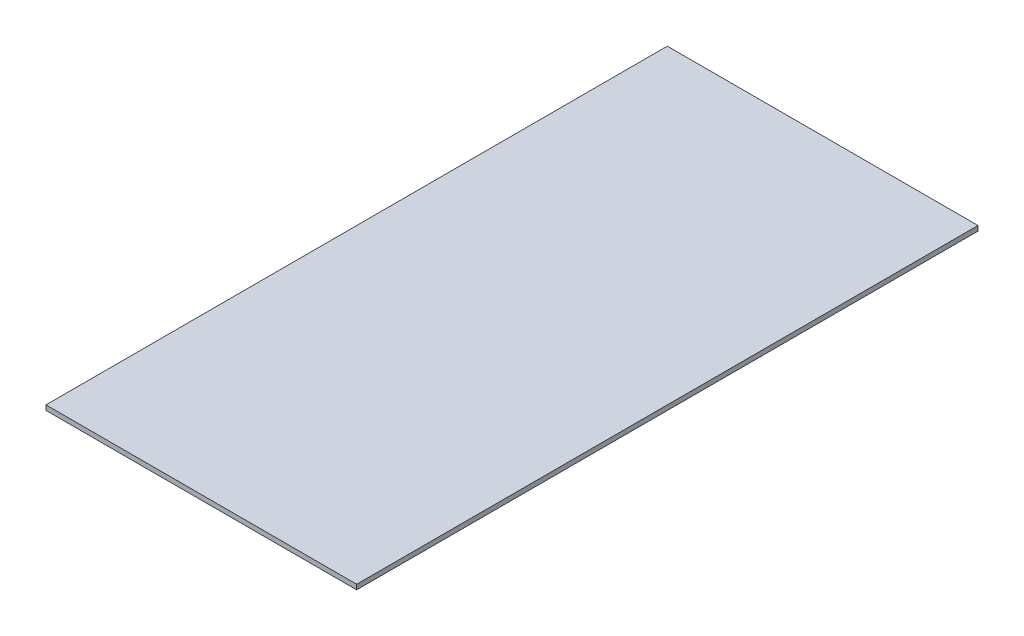
ISO-10303-21;
HEADER;
FILE_DESCRIPTION(('STEP AP214'),'2;1');
FILE_NAME('part.step','',(''),(''),'','','');
FILE_SCHEMA(('AUTOMOTIVE_DESIGN { 1 0 10303 214 1 1 1 1 }'));
ENDSEC;
DATA;
#1=APPLICATION_CONTEXT('core data for automotive mechanical design processes');
#2=APPLICATION_PROTOCOL_DEFINITION('international standard','automotive_design',2000,#1);
#3=PRODUCT_CONTEXT('',#1,'mechanical');
#4=PRODUCT('Part','Part','',(#3));
#5=PRODUCT_RELATED_PRODUCT_CATEGORY('part','',(#4));
#6=PRODUCT_DEFINITION_FORMATION('','',#4);
#7=PRODUCT_DEFINITION_CONTEXT('part definition',#1,'design');
#8=PRODUCT_DEFINITION('design','',#6,#7);
#9=PRODUCT_DEFINITION_SHAPE('','',#8);
#10=(LENGTH_UNIT() NAMED_UNIT(*) SI_UNIT(.MILLI.,.METRE.));
#11=(NAMED_UNIT(*) PLANE_ANGLE_UNIT() SI_UNIT($,.RADIAN.));
#12=(NAMED_UNIT(*) SI_UNIT($,.STERADIAN.) SOLID_ANGLE_UNIT());
#13=UNCERTAINTY_MEASURE_WITH_UNIT(LENGTH_MEASURE(1.E-05),#10,'distance_accuracy_value','');
#14=(GEOMETRIC_REPRESENTATION_CONTEXT(3) GLOBAL_UNCERTAINTY_ASSIGNED_CONTEXT((#13)) GLOBAL_UNIT_ASSIGNED_CONTEXT((#10,
#11,#12)) REPRESENTATION_CONTEXT('',''));
#15=CARTESIAN_POINT('',(0.,0.,0.));
#16=DIRECTION('',(0.,0.,1.));
#17=DIRECTION('',(1.,0.,0.));
#18=AXIS2_PLACEMENT_3D('',#15,#16,#17);
#19=CARTESIAN_POINT('',(0.,3.175,0.));
#20=DIRECTION('',(-1.,0.,0.));
#21=DIRECTION('',(0.,0.,1.));
#22=AXIS2_PLACEMENT_3D('',#19,#20,#21);
#23=PLANE('',#22);
#24=DIRECTION('',(0.,0.,-1.));
#25=VECTOR('',#24,1.);
#26=CARTESIAN_POINT('',(0.,0.,0.));
#27=LINE('',#26,#25);
#28=CARTESIAN_POINT('',(0.,0.,406.4));
#29=VERTEX_POINT('',#28);
#30=CARTESIAN_POINT('',(0.,0.,0.));
#31=VERTEX_POINT('',#30);
#32=EDGE_CURVE('E104',#29,#31,#27,.T.);
#33=ORIENTED_EDGE('',*,*,#32,.T.);
#34=DIRECTION('',(0.,-1.,0.));
#35=VECTOR('',#34,1.);
#36=CARTESIAN_POINT('',(0.,3.175,0.));
#37=LINE('',#36,#35);
#38=CARTESIAN_POINT('',(0.,3.175,0.));
#39=VERTEX_POINT('',#38);
#40=EDGE_CURVE('E11',#39,#31,#37,.T.);
#41=ORIENTED_EDGE('',*,*,#40,.F.);
#42=DIRECTION('',(0.,0.,-1.));
#43=VECTOR('',#42,1.);
#44=CARTESIAN_POINT('',(0.,3.175,0.));
#45=LINE('',#44,#43);
#46=CARTESIAN_POINT('',(0.,3.175,406.4));
#47=VERTEX_POINT('',#46);
#48=EDGE_CURVE('E92',#47,#39,#45,.T.);
#49=ORIENTED_EDGE('',*,*,#48,.F.);
#50=DIRECTION('',(0.,-1.,0.));
#51=VECTOR('',#50,1.);
#52=CARTESIAN_POINT('',(0.,3.175,406.4));
#53=LINE('',#52,#51);
#54=EDGE_CURVE('E100',#47,#29,#53,.T.);
#55=ORIENTED_EDGE('',*,*,#54,.T.);
#56=EDGE_LOOP('',(#33,#41,#49,#55));
#57=FACE_BOUND('',#56,.T.);
#58=ADVANCED_FACE('F41',(#57),#23,.F.);
#59=CARTESIAN_POINT('',(0.,3.175,0.));
#60=DIRECTION('',(0.,0.,1.));
#61=DIRECTION('',(1.,0.,0.));
#62=AXIS2_PLACEMENT_3D('',#59,#60,#61);
#63=PLANE('',#62);
#64=DIRECTION('',(-1.,0.,0.));
#65=VECTOR('',#64,1.);
#66=CARTESIAN_POINT('',(0.,0.,0.));
#67=LINE('',#66,#65);
#68=CARTESIAN_POINT('',(-203.2,0.,0.));
#69=VERTEX_POINT('',#68);
#70=EDGE_CURVE('E96',#31,#69,#67,.T.);
#71=ORIENTED_EDGE('',*,*,#70,.T.);
#72=DIRECTION('',(0.,-1.,0.));
#73=VECTOR('',#72,1.);
#74=CARTESIAN_POINT('',(-203.2,3.175,0.));
#75=LINE('',#74,#73);
#76=CARTESIAN_POINT('',(-203.2,3.175,0.));
#77=VERTEX_POINT('',#76);
#78=EDGE_CURVE('E49',#77,#69,#75,.T.);
#79=ORIENTED_EDGE('',*,*,#78,.F.);
#80=DIRECTION('',(-1.,0.,0.));
#81=VECTOR('',#80,1.);
#82=CARTESIAN_POINT('',(0.,3.175,0.));
#83=LINE('',#82,#81);
#84=EDGE_CURVE('E87',#39,#77,#83,.T.);
#85=ORIENTED_EDGE('',*,*,#84,.F.);
#86=ORIENTED_EDGE('',*,*,#40,.T.);
#87=EDGE_LOOP('',(#71,#79,#85,#86));
#88=FACE_BOUND('',#87,.T.);
#89=ADVANCED_FACE('F95',(#88),#63,.F.);
#90=CARTESIAN_POINT('',(-203.2,3.175,0.));
#91=DIRECTION('',(1.,0.,0.));
#92=DIRECTION('',(0.,0.,-1.));
#93=AXIS2_PLACEMENT_3D('',#90,#91,#92);
#94=PLANE('',#93);
#95=DIRECTION('',(0.,0.,1.));
#96=VECTOR('',#95,1.);
#97=CARTESIAN_POINT('',(-203.2,0.,0.));
#98=LINE('',#97,#96);
#99=CARTESIAN_POINT('',(-203.2,0.,406.4));
#100=VERTEX_POINT('',#99);
#101=EDGE_CURVE('E74',#69,#100,#98,.T.);
#102=ORIENTED_EDGE('',*,*,#101,.T.);
#103=DIRECTION('',(0.,-1.,0.));
#104=VECTOR('',#103,1.);
#105=CARTESIAN_POINT('',(-203.2,3.175,406.4));
#106=LINE('',#105,#104);
#107=CARTESIAN_POINT('',(-203.2,3.175,406.4));
#108=VERTEX_POINT('',#107);
#109=EDGE_CURVE('E97',#108,#100,#106,.T.);
#110=ORIENTED_EDGE('',*,*,#109,.F.);
#111=DIRECTION('',(0.,0.,1.));
#112=VECTOR('',#111,1.);
#113=CARTESIAN_POINT('',(-203.2,3.175,0.));
#114=LINE('',#113,#112);
#115=EDGE_CURVE('E90',#77,#108,#114,.T.);
#116=ORIENTED_EDGE('',*,*,#115,.F.);
#117=ORIENTED_EDGE('',*,*,#78,.T.);
#118=EDGE_LOOP('',(#102,#110,#116,#117));
#119=FACE_BOUND('',#118,.T.);
#120=ADVANCED_FACE('F98',(#119),#94,.F.);
#121=CARTESIAN_POINT('',(0.,3.175,406.4));
#122=DIRECTION('',(0.,0.,-1.));
#123=DIRECTION('',(-1.,0.,0.));
#124=AXIS2_PLACEMENT_3D('',#121,#122,#123);
#125=PLANE('',#124);
#126=DIRECTION('',(1.,0.,0.));
#127=VECTOR('',#126,1.);
#128=CARTESIAN_POINT('',(0.,0.,406.4));
#129=LINE('',#128,#127);
#130=EDGE_CURVE('E80',#100,#29,#129,.T.);
#131=ORIENTED_EDGE('',*,*,#130,.T.);
#132=ORIENTED_EDGE('',*,*,#54,.F.);
#133=DIRECTION('',(1.,0.,0.));
#134=VECTOR('',#133,1.);
#135=CARTESIAN_POINT('',(0.,3.175,406.4));
#136=LINE('',#135,#134);
#137=EDGE_CURVE('E57',#108,#47,#136,.T.);
#138=ORIENTED_EDGE('',*,*,#137,.F.);
#139=ORIENTED_EDGE('',*,*,#109,.T.);
#140=EDGE_LOOP('',(#131,#132,#138,#139));
#141=FACE_BOUND('',#140,.T.);
#142=ADVANCED_FACE('F111',(#141),#125,.F.);
#143=CARTESIAN_POINT('',(0.,3.175,0.));
#144=DIRECTION('',(0.,-1.,0.));
#145=DIRECTION('',(0.,0.,-1.));
#146=AXIS2_PLACEMENT_3D('',#143,#144,#145);
#147=PLANE('',#146);
#148=ORIENTED_EDGE('',*,*,#48,.T.);
#149=ORIENTED_EDGE('',*,*,#84,.T.);
#150=ORIENTED_EDGE('',*,*,#115,.T.);
#151=ORIENTED_EDGE('',*,*,#137,.T.);
#152=EDGE_LOOP('',(#148,#149,#150,#151));
#153=FACE_BOUND('',#152,.T.);
#154=ADVANCED_FACE('F88',(#153),#147,.F.);
#155=CARTESIAN_POINT('',(0.,0.,0.));
#156=DIRECTION('',(0.,-1.,0.));
#157=DIRECTION('',(0.,0.,-1.));
#158=AXIS2_PLACEMENT_3D('',#155,#156,#157);
#159=PLANE('',#158);
#160=ORIENTED_EDGE('',*,*,#32,.F.);
#161=ORIENTED_EDGE('',*,*,#130,.F.);
#162=ORIENTED_EDGE('',*,*,#101,.F.);
#163=ORIENTED_EDGE('',*,*,#70,.F.);
#164=EDGE_LOOP('',(#160,#161,#162,#163));
#165=FACE_BOUND('',#164,.T.);
#166=ADVANCED_FACE('F114',(#165),#159,.T.);
#167=CLOSED_SHELL('',(#58,#89,#120,#142,#154,#166));
#168=MANIFOLD_SOLID_BREP('B2',#167);
#169=ADVANCED_BREP_SHAPE_REPRESENTATION('',(#18,#168),#14);
#170=SHAPE_DEFINITION_REPRESENTATION(#9,#169);
ENDSEC;
END-ISO-10303-21;
